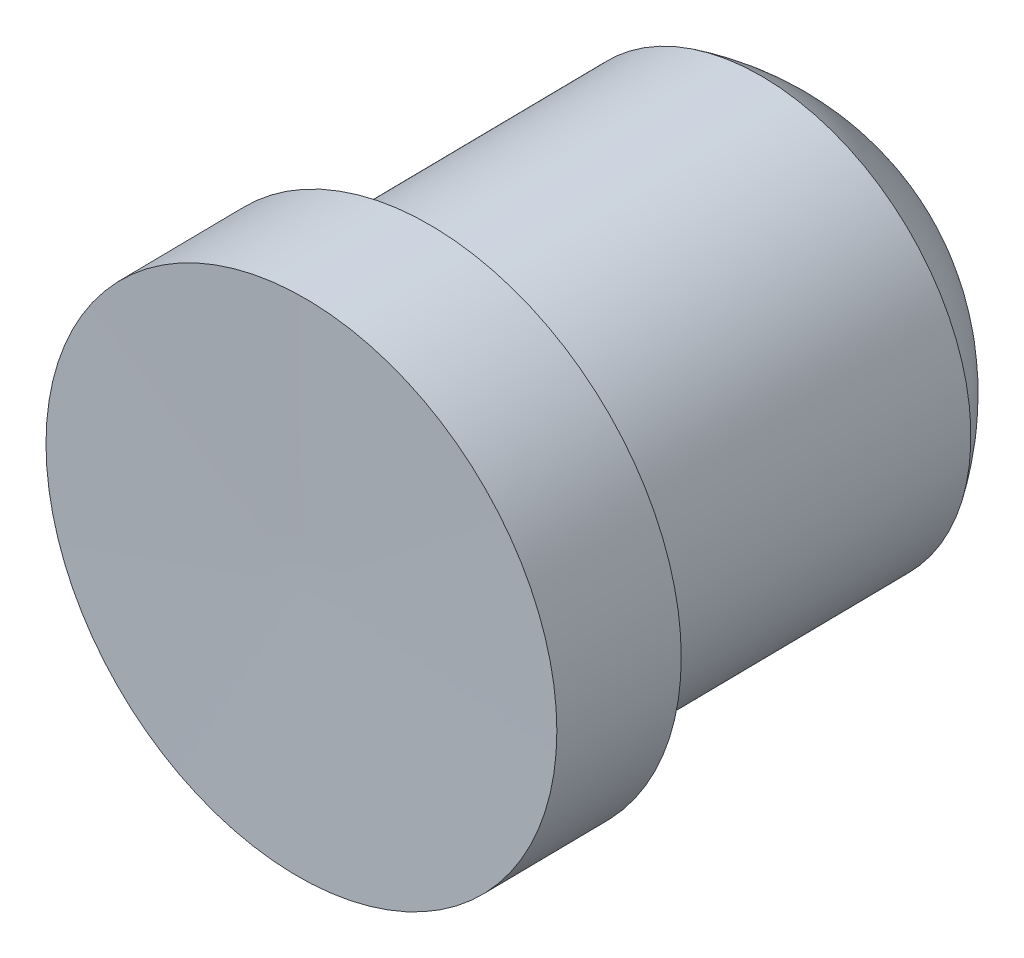
ISO-10303-21;
HEADER;
FILE_DESCRIPTION(('STEP AP214'),'2;1');
FILE_NAME('part.step','',(''),(''),'','','');
FILE_SCHEMA(('AUTOMOTIVE_DESIGN { 1 0 10303 214 1 1 1 1 }'));
ENDSEC;
DATA;
#1=APPLICATION_CONTEXT('core data for automotive mechanical design processes');
#2=APPLICATION_PROTOCOL_DEFINITION('international standard','automotive_design',2000,#1);
#3=PRODUCT_CONTEXT('',#1,'mechanical');
#4=PRODUCT('Part','Part','',(#3));
#5=PRODUCT_RELATED_PRODUCT_CATEGORY('part','',(#4));
#6=PRODUCT_DEFINITION_FORMATION('','',#4);
#7=PRODUCT_DEFINITION_CONTEXT('part definition',#1,'design');
#8=PRODUCT_DEFINITION('design','',#6,#7);
#9=PRODUCT_DEFINITION_SHAPE('','',#8);
#10=(LENGTH_UNIT() NAMED_UNIT(*) SI_UNIT(.MILLI.,.METRE.));
#11=(NAMED_UNIT(*) PLANE_ANGLE_UNIT() SI_UNIT($,.RADIAN.));
#12=(NAMED_UNIT(*) SI_UNIT($,.STERADIAN.) SOLID_ANGLE_UNIT());
#13=UNCERTAINTY_MEASURE_WITH_UNIT(LENGTH_MEASURE(1.E-05),#10,'distance_accuracy_value','');
#14=(GEOMETRIC_REPRESENTATION_CONTEXT(3) GLOBAL_UNCERTAINTY_ASSIGNED_CONTEXT((#13)) GLOBAL_UNIT_ASSIGNED_CONTEXT((#10,
#11,#12)) REPRESENTATION_CONTEXT('',''));
#15=CARTESIAN_POINT('',(0.,0.,0.));
#16=DIRECTION('',(0.,0.,1.));
#17=DIRECTION('',(1.,0.,0.));
#18=AXIS2_PLACEMENT_3D('',#15,#16,#17);
#19=CARTESIAN_POINT('',(2.81501661165474,0.,-28.0462990036808));
#20=DIRECTION('',(0.0132378857985347,0.,0.999912375350753));
#21=DIRECTION('',(0.999912375350753,0.,-0.0132378857985347));
#22=AXIS2_PLACEMENT_3D('',#19,#20,#21);
#23=CONICAL_SURFACE('',#22,0.,1.55711025134633);
#24=CARTESIAN_POINT('',(2.81556016970433,0.,-28.0052418115599));
#25=DIRECTION('',(-0.0132378857985347,0.,-0.999912375350753));
#26=DIRECTION('',(-0.999912375350753,0.,0.0132378857985347));
#27=AXIS2_PLACEMENT_3D('',#24,#25,#26);
#28=CIRCLE('',#27,3.);
#29=CARTESIAN_POINT('',(-0.184176956347925,0.,-27.9655281541643));
#30=VERTEX_POINT('',#29);
#31=EDGE_CURVE('E11',#30,#30,#28,.T.);
#32=ORIENTED_EDGE('',*,*,#31,.F.);
#33=EDGE_LOOP('',(#32));
#34=FACE_BOUND('',#33,.T.);
#35=CARTESIAN_POINT('',(2.81501661165474,0.,-28.0462990036808));
#36=VERTEX_POINT('',#35);
#37=VERTEX_LOOP('',#36);
#38=FACE_BOUND('',#37,.T.);
#39=ADVANCED_FACE('F35',(#34,#38),#23,.F.);
#40=CARTESIAN_POINT('',(2.67475035306098,0.,-38.6411908124303));
#41=DIRECTION('',(-0.0132378857985347,0.,-0.999912375350753));
#42=DIRECTION('',(-0.999912375350753,0.,0.0132378857985347));
#43=AXIS2_PLACEMENT_3D('',#40,#41,#42);
#44=CYLINDRICAL_SURFACE('',#43,3.);
#45=CARTESIAN_POINT('',(2.79570148118338,0.,-29.505250854736));
#46=DIRECTION('',(-0.0132378857985347,0.,-0.999912375350753));
#47=DIRECTION('',(-0.999912375350753,0.,0.0132378857985347));
#48=AXIS2_PLACEMENT_3D('',#45,#46,#47);
#49=CIRCLE('',#48,3.);
#50=CARTESIAN_POINT('',(-0.204035644868877,0.,-29.4655371973404));
#51=VERTEX_POINT('',#50);
#52=EDGE_CURVE('E42',#51,#51,#49,.T.);
#53=ORIENTED_EDGE('',*,*,#52,.F.);
#54=EDGE_LOOP('',(#53));
#55=FACE_BOUND('',#54,.T.);
#56=ORIENTED_EDGE('',*,*,#31,.T.);
#57=EDGE_LOOP('',(#56));
#58=FACE_BOUND('',#57,.T.);
#59=ADVANCED_FACE('F49',(#55,#58),#44,.T.);
#60=CARTESIAN_POINT('',(2.79570148118338,0.,-29.505250854736));
#61=DIRECTION('',(0.0132378857985347,0.,0.999912375350753));
#62=DIRECTION('',(0.999912375350753,0.,-0.0132378857985347));
#63=AXIS2_PLACEMENT_3D('',#60,#61,#62);
#64=CONICAL_SURFACE('',#63,3.,1.55711025134633);
#65=CARTESIAN_POINT('',(2.79561088817512,0.,-29.5120937200895));
#66=DIRECTION('',(-0.0132378857985347,0.,-0.999912375350753));
#67=DIRECTION('',(-0.999912375350753,0.,0.0132378857985347));
#68=AXIS2_PLACEMENT_3D('',#65,#66,#67);
#69=CIRCLE('',#68,2.5);
#70=CARTESIAN_POINT('',(0.29582994979823,0.,-29.4789990055932));
#71=VERTEX_POINT('',#70);
#72=EDGE_CURVE('E77',#71,#71,#69,.T.);
#73=ORIENTED_EDGE('',*,*,#72,.F.);
#74=EDGE_LOOP('',(#73));
#75=FACE_BOUND('',#74,.T.);
#76=ORIENTED_EDGE('',*,*,#52,.T.);
#77=EDGE_LOOP('',(#76));
#78=FACE_BOUND('',#77,.T.);
#79=ADVANCED_FACE('F54',(#75,#78),#64,.T.);
#80=CARTESIAN_POINT('',(2.67475035306098,0.,-38.6411908124303));
#81=DIRECTION('',(-0.0132378857985347,0.,-0.999912375350753));
#82=DIRECTION('',(-0.999912375350753,0.,0.0132378857985347));
#83=AXIS2_PLACEMENT_3D('',#80,#81,#82);
#84=CYLINDRICAL_SURFACE('',#83,2.5);
#85=CARTESIAN_POINT('',(2.74265934498098,0.,-33.5117432214925));
#86=DIRECTION('',(-0.0132378857985347,0.,-0.999912375350753));
#87=DIRECTION('',(-0.999912375350753,0.,0.0132378857985347));
#88=AXIS2_PLACEMENT_3D('',#85,#86,#87);
#89=CIRCLE('',#88,2.5);
#90=CARTESIAN_POINT('',(0.242878406604093,0.,-33.4786485069962));
#91=VERTEX_POINT('',#90);
#92=EDGE_CURVE('E76',#91,#91,#89,.T.);
#93=ORIENTED_EDGE('',*,*,#92,.F.);
#94=EDGE_LOOP('',(#93));
#95=FACE_BOUND('',#94,.T.);
#96=ORIENTED_EDGE('',*,*,#72,.T.);
#97=EDGE_LOOP('',(#96));
#98=FACE_BOUND('',#97,.T.);
#99=ADVANCED_FACE('F61',(#95,#98),#84,.T.);
#100=CARTESIAN_POINT('',(2.98650085419684,0.,-31.7365130745269));
#101=DIRECTION('',(0.,-1.,0.));
#102=DIRECTION('',(-0.999912375350753,0.,0.0132378857985347));
#103=AXIS2_PLACEMENT_3D('',#100,#101,#102);
#104=CIRCLE('',#103,3.24999999999999);
#105=TRIMMED_CURVE('',#104,(PARAMETER_VALUE(-1.5029535734627)),
(PARAMETER_VALUE(1.5029535734627)),.T.,.PARAMETER.);
#106=CARTESIAN_POINT('',(2.76620031090881,0.,-31.7335965055301));
#107=DIRECTION('',(-0.0132378857985347,0.,-0.999912375350753));
#108=AXIS1_PLACEMENT('',#106,#107);
#109=SURFACE_OF_REVOLUTION('',#105,#108);
#110=CARTESIAN_POINT('',(2.72327615406303,0.,-34.9758359601373));
#111=VERTEX_POINT('',#110);
#112=VERTEX_LOOP('',#111);
#113=FACE_BOUND('',#112,.T.);
#114=ORIENTED_EDGE('',*,*,#92,.T.);
#115=EDGE_LOOP('',(#114));
#116=FACE_BOUND('',#115,.T.);
#117=ADVANCED_FACE('F68',(#113,#116),#109,.T.);
#118=CLOSED_SHELL('',(#39,#59,#79,#99,#117));
#119=MANIFOLD_SOLID_BREP('B2',#118);
#120=ADVANCED_BREP_SHAPE_REPRESENTATION('',(#18,#119),#14);
#121=SHAPE_DEFINITION_REPRESENTATION(#9,#120);
ENDSEC;
END-ISO-10303-21;
